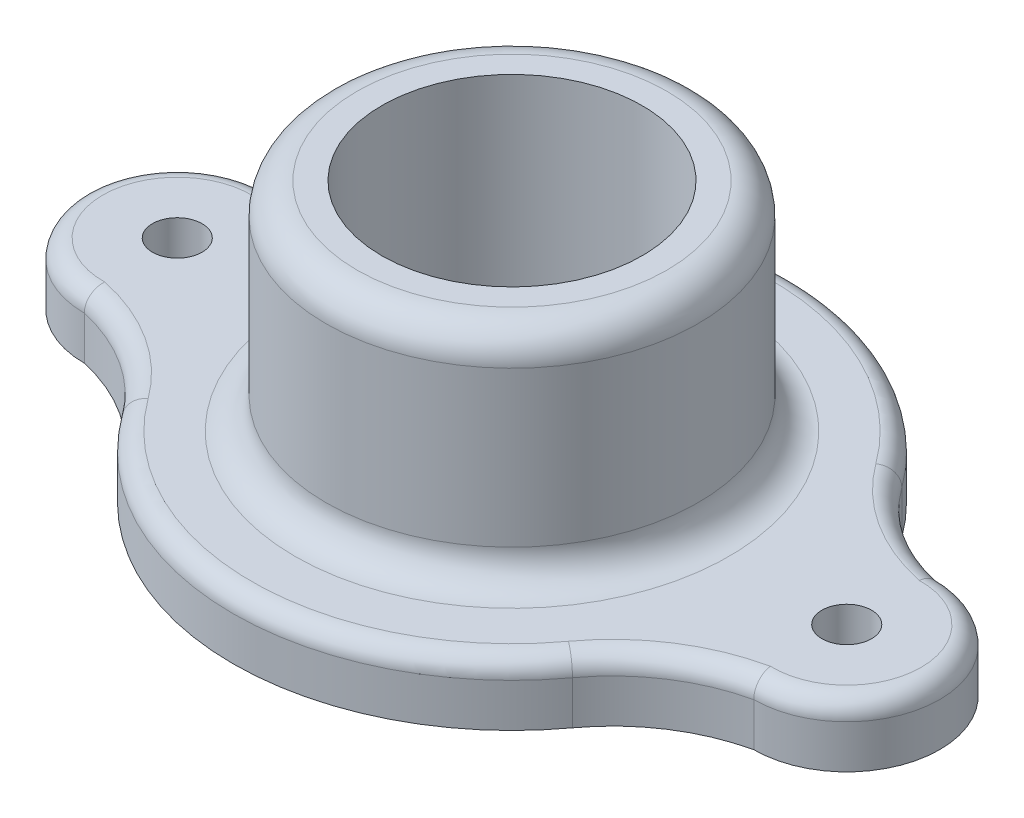
ISO-10303-21;
HEADER;
FILE_DESCRIPTION(('STEP AP214'),'2;1');
FILE_NAME('part.step','',(''),(''),'','','');
FILE_SCHEMA(('AUTOMOTIVE_DESIGN { 1 0 10303 214 1 1 1 1 }'));
ENDSEC;
DATA;
#1=APPLICATION_CONTEXT('core data for automotive mechanical design processes');
#2=APPLICATION_PROTOCOL_DEFINITION('international standard','automotive_design',2000,#1);
#3=PRODUCT_CONTEXT('',#1,'mechanical');
#4=PRODUCT('Part','Part','',(#3));
#5=PRODUCT_RELATED_PRODUCT_CATEGORY('part','',(#4));
#6=PRODUCT_DEFINITION_FORMATION('','',#4);
#7=PRODUCT_DEFINITION_CONTEXT('part definition',#1,'design');
#8=PRODUCT_DEFINITION('design','',#6,#7);
#9=PRODUCT_DEFINITION_SHAPE('','',#8);
#10=(LENGTH_UNIT() NAMED_UNIT(*) SI_UNIT(.MILLI.,.METRE.));
#11=(NAMED_UNIT(*) PLANE_ANGLE_UNIT() SI_UNIT($,.RADIAN.));
#12=(NAMED_UNIT(*) SI_UNIT($,.STERADIAN.) SOLID_ANGLE_UNIT());
#13=UNCERTAINTY_MEASURE_WITH_UNIT(LENGTH_MEASURE(1.E-05),#10,'distance_accuracy_value','');
#14=(GEOMETRIC_REPRESENTATION_CONTEXT(3) GLOBAL_UNCERTAINTY_ASSIGNED_CONTEXT((#13)) GLOBAL_UNIT_ASSIGNED_CONTEXT((#10,
#11,#12)) REPRESENTATION_CONTEXT('',''));
#15=CARTESIAN_POINT('',(0.,0.,0.));
#16=DIRECTION('',(0.,0.,1.));
#17=DIRECTION('',(1.,0.,0.));
#18=AXIS2_PLACEMENT_3D('',#15,#16,#17);
#19=CARTESIAN_POINT('',(-30.2666738587196,10.,-22.1399741086095));
#20=DIRECTION('',(0.,1.,0.));
#21=DIRECTION('',(0.,0.,1.));
#22=AXIS2_PLACEMENT_3D('',#19,#20,#21);
#23=PLANE('',#22);
#24=CARTESIAN_POINT('',(60.5333477174391,10.,44.2799482172191));
#25=DIRECTION('',(0.,1.,0.));
#26=DIRECTION('',(0.,0.,1.));
#27=AXIS2_PLACEMENT_3D('',#24,#25,#26);
#28=CIRCLE('',#27,33.);
#29=CARTESIAN_POINT('',(33.8986747217659,10.,24.7967710016427));
#30=VERTEX_POINT('',#29);
#31=CARTESIAN_POINT('',(53.6955450866771,10.,11.9961371785152));
#32=VERTEX_POINT('',#31);
#33=EDGE_CURVE('E250',#30,#32,#28,.F.);
#34=ORIENTED_EDGE('',*,*,#33,.T.);
#35=CARTESIAN_POINT('',(54.,10.,0.));
#36=DIRECTION('',(0.,1.,0.));
#37=DIRECTION('',(0.,0.,1.));
#38=AXIS2_PLACEMENT_3D('',#35,#36,#37);
#39=CIRCLE('',#38,12.);
#40=CARTESIAN_POINT('',(53.6955450866771,10.,-11.9961371785152));
#41=VERTEX_POINT('',#40);
#42=EDGE_CURVE('E266',#32,#41,#39,.T.);
#43=ORIENTED_EDGE('',*,*,#42,.T.);
#44=CARTESIAN_POINT('',(60.5333477174391,10.,-44.2799482172191));
#45=DIRECTION('',(0.,1.,0.));
#46=DIRECTION('',(0.,0.,1.));
#47=AXIS2_PLACEMENT_3D('',#44,#45,#46);
#48=CIRCLE('',#47,33.);
#49=CARTESIAN_POINT('',(33.8986747217659,10.,-24.7967710016427));
#50=VERTEX_POINT('',#49);
#51=EDGE_CURVE('E263',#41,#50,#48,.F.);
#52=ORIENTED_EDGE('',*,*,#51,.T.);
#53=CARTESIAN_POINT('',(0.,10.,0.));
#54=DIRECTION('',(0.,1.,0.));
#55=DIRECTION('',(0.,0.,1.));
#56=AXIS2_PLACEMENT_3D('',#53,#54,#55);
#57=CIRCLE('',#56,42.);
#58=CARTESIAN_POINT('',(-33.8986747217659,10.,-24.7967710016427));
#59=VERTEX_POINT('',#58);
#60=EDGE_CURVE('E260',#50,#59,#57,.T.);
#61=ORIENTED_EDGE('',*,*,#60,.T.);
#62=CARTESIAN_POINT('',(-60.5333477174391,10.,-44.2799482172191));
#63=DIRECTION('',(0.,1.,0.));
#64=DIRECTION('',(0.,0.,1.));
#65=AXIS2_PLACEMENT_3D('',#62,#63,#64);
#66=CIRCLE('',#65,33.);
#67=CARTESIAN_POINT('',(-53.695545086677,10.,-11.9961371785151));
#68=VERTEX_POINT('',#67);
#69=EDGE_CURVE('E257',#59,#68,#66,.F.);
#70=ORIENTED_EDGE('',*,*,#69,.T.);
#71=CARTESIAN_POINT('',(-54.,10.,0.));
#72=DIRECTION('',(0.,1.,0.));
#73=DIRECTION('',(0.,0.,1.));
#74=AXIS2_PLACEMENT_3D('',#71,#72,#73);
#75=CIRCLE('',#74,12.);
#76=CARTESIAN_POINT('',(-53.6955450866771,10.,11.9961371785151));
#77=VERTEX_POINT('',#76);
#78=EDGE_CURVE('E254',#68,#77,#75,.T.);
#79=ORIENTED_EDGE('',*,*,#78,.T.);
#80=CARTESIAN_POINT('',(-60.5333477174391,10.,44.2799482172191));
#81=DIRECTION('',(0.,1.,0.));
#82=DIRECTION('',(0.,0.,1.));
#83=AXIS2_PLACEMENT_3D('',#80,#81,#82);
#84=CIRCLE('',#83,33.);
#85=CARTESIAN_POINT('',(-33.8986747217659,10.,24.7967710016427));
#86=VERTEX_POINT('',#85);
#87=EDGE_CURVE('E247',#77,#86,#84,.F.);
#88=ORIENTED_EDGE('',*,*,#87,.T.);
#89=CARTESIAN_POINT('',(0.,10.,0.));
#90=DIRECTION('',(0.,1.,0.));
#91=DIRECTION('',(0.,0.,1.));
#92=AXIS2_PLACEMENT_3D('',#89,#90,#91);
#93=CIRCLE('',#92,42.);
#94=EDGE_CURVE('E244',#86,#30,#93,.T.);
#95=ORIENTED_EDGE('',*,*,#94,.T.);
#96=EDGE_LOOP('',(#34,#43,#52,#61,#70,#79,#88,#95));
#97=FACE_BOUND('',#96,.T.);
#98=CARTESIAN_POINT('',(0.,10.,0.));
#99=DIRECTION('',(0.,1.,0.));
#100=DIRECTION('',(0.,0.,1.));
#101=AXIS2_PLACEMENT_3D('',#98,#99,#100);
#102=CIRCLE('',#101,35.);
#103=CARTESIAN_POINT('',(0.,10.,35.));
#104=VERTEX_POINT('',#103);
#105=EDGE_CURVE('E240',#104,#104,#102,.F.);
#106=ORIENTED_EDGE('',*,*,#105,.T.);
#107=EDGE_LOOP('',(#106));
#108=FACE_BOUND('',#107,.T.);
#109=CARTESIAN_POINT('',(-54.,10.,0.));
#110=DIRECTION('',(0.,1.,0.));
#111=DIRECTION('',(0.,0.,1.));
#112=AXIS2_PLACEMENT_3D('',#109,#110,#111);
#113=CIRCLE('',#112,4.);
#114=CARTESIAN_POINT('',(-54.,10.,4.));
#115=VERTEX_POINT('',#114);
#116=EDGE_CURVE('E173',#115,#115,#113,.T.);
#117=ORIENTED_EDGE('',*,*,#116,.F.);
#118=EDGE_LOOP('',(#117));
#119=FACE_BOUND('',#118,.T.);
#120=CARTESIAN_POINT('',(54.,10.,0.));
#121=DIRECTION('',(0.,1.,0.));
#122=DIRECTION('',(0.,0.,1.));
#123=AXIS2_PLACEMENT_3D('',#120,#121,#122);
#124=CIRCLE('',#123,4.);
#125=CARTESIAN_POINT('',(54.,10.,4.));
#126=VERTEX_POINT('',#125);
#127=EDGE_CURVE('E435',#126,#126,#124,.T.);
#128=ORIENTED_EDGE('',*,*,#127,.F.);
#129=EDGE_LOOP('',(#128));
#130=FACE_BOUND('',#129,.T.);
#131=ADVANCED_FACE('F47',(#97,#108,#119,#130),#23,.T.);
#132=CARTESIAN_POINT('',(-30.2666738587196,0.,-22.1399741086095));
#133=DIRECTION('',(0.,1.,0.));
#134=DIRECTION('',(0.,0.,1.));
#135=AXIS2_PLACEMENT_3D('',#132,#133,#134);
#136=PLANE('',#135);
#137=CARTESIAN_POINT('',(0.,0.,0.));
#138=DIRECTION('',(0.,1.,0.));
#139=DIRECTION('',(0.,0.,1.));
#140=AXIS2_PLACEMENT_3D('',#137,#138,#139);
#141=CIRCLE('',#140,26.);
#142=CARTESIAN_POINT('',(0.,0.,26.));
#143=VERTEX_POINT('',#142);
#144=EDGE_CURVE('E154',#143,#143,#141,.T.);
#145=ORIENTED_EDGE('',*,*,#144,.T.);
#146=EDGE_LOOP('',(#145));
#147=FACE_BOUND('',#146,.T.);
#148=CARTESIAN_POINT('',(-60.5333477174391,0.,-44.2799482172191));
#149=DIRECTION('',(0.,-1.,0.));
#150=DIRECTION('',(0.,0.,1.));
#151=AXIS2_PLACEMENT_3D('',#148,#149,#150);
#152=CIRCLE('',#151,30.);
#153=CARTESIAN_POINT('',(-36.3200086304635,0.,-26.5679689303315));
#154=VERTEX_POINT('',#153);
#155=CARTESIAN_POINT('',(-54.,0.,-15.));
#156=VERTEX_POINT('',#155);
#157=EDGE_CURVE('E162',#154,#156,#152,.T.);
#158=ORIENTED_EDGE('',*,*,#157,.F.);
#159=CARTESIAN_POINT('',(0.,0.,0.));
#160=DIRECTION('',(0.,1.,0.));
#161=DIRECTION('',(0.,0.,1.));
#162=AXIS2_PLACEMENT_3D('',#159,#160,#161);
#163=CIRCLE('',#162,45.);
#164=CARTESIAN_POINT('',(36.3200086304635,0.,-26.5679689303315));
#165=VERTEX_POINT('',#164);
#166=EDGE_CURVE('E199',#165,#154,#163,.T.);
#167=ORIENTED_EDGE('',*,*,#166,.F.);
#168=CARTESIAN_POINT('',(60.5333477174391,0.,-44.2799482172191));
#169=DIRECTION('',(0.,-1.,0.));
#170=DIRECTION('',(0.,0.,-1.));
#171=AXIS2_PLACEMENT_3D('',#168,#169,#170);
#172=CIRCLE('',#171,30.);
#173=CARTESIAN_POINT('',(54.,0.,-15.));
#174=VERTEX_POINT('',#173);
#175=EDGE_CURVE('E195',#174,#165,#172,.T.);
#176=ORIENTED_EDGE('',*,*,#175,.F.);
#177=CARTESIAN_POINT('',(54.,0.,0.));
#178=DIRECTION('',(0.,1.,0.));
#179=DIRECTION('',(0.,0.,1.));
#180=AXIS2_PLACEMENT_3D('',#177,#178,#179);
#181=CIRCLE('',#180,15.);
#182=CARTESIAN_POINT('',(54.,0.,15.));
#183=VERTEX_POINT('',#182);
#184=EDGE_CURVE('E191',#183,#174,#181,.T.);
#185=ORIENTED_EDGE('',*,*,#184,.F.);
#186=CARTESIAN_POINT('',(60.5333477174391,0.,44.2799482172191));
#187=DIRECTION('',(0.,-1.,0.));
#188=DIRECTION('',(0.,0.,1.));
#189=AXIS2_PLACEMENT_3D('',#186,#187,#188);
#190=CIRCLE('',#189,30.);
#191=CARTESIAN_POINT('',(36.3200086304635,0.,26.5679689303314));
#192=VERTEX_POINT('',#191);
#193=EDGE_CURVE('E187',#192,#183,#190,.T.);
#194=ORIENTED_EDGE('',*,*,#193,.F.);
#195=CARTESIAN_POINT('',(0.,0.,0.));
#196=DIRECTION('',(0.,1.,0.));
#197=DIRECTION('',(0.,0.,1.));
#198=AXIS2_PLACEMENT_3D('',#195,#196,#197);
#199=CIRCLE('',#198,45.);
#200=CARTESIAN_POINT('',(-36.3200086304635,0.,26.5679689303315));
#201=VERTEX_POINT('',#200);
#202=EDGE_CURVE('E183',#201,#192,#199,.T.);
#203=ORIENTED_EDGE('',*,*,#202,.F.);
#204=CARTESIAN_POINT('',(-60.5333477174391,0.,44.2799482172191));
#205=DIRECTION('',(0.,-1.,0.));
#206=DIRECTION('',(0.,0.,-1.));
#207=AXIS2_PLACEMENT_3D('',#204,#205,#206);
#208=CIRCLE('',#207,30.);
#209=CARTESIAN_POINT('',(-54.,0.,15.));
#210=VERTEX_POINT('',#209);
#211=EDGE_CURVE('E165',#210,#201,#208,.T.);
#212=ORIENTED_EDGE('',*,*,#211,.F.);
#213=CARTESIAN_POINT('',(-54.,0.,0.));
#214=DIRECTION('',(0.,1.,0.));
#215=DIRECTION('',(0.,0.,1.));
#216=AXIS2_PLACEMENT_3D('',#213,#214,#215);
#217=CIRCLE('',#216,15.);
#218=EDGE_CURVE('E147',#156,#210,#217,.T.);
#219=ORIENTED_EDGE('',*,*,#218,.F.);
#220=EDGE_LOOP('',(#158,#167,#176,#185,#194,#203,#212,#219));
#221=FACE_BOUND('',#220,.T.);
#222=CARTESIAN_POINT('',(-54.,0.,0.));
#223=DIRECTION('',(0.,1.,0.));
#224=DIRECTION('',(0.,0.,1.));
#225=AXIS2_PLACEMENT_3D('',#222,#223,#224);
#226=CIRCLE('',#225,4.);
#227=CARTESIAN_POINT('',(-54.,0.,4.));
#228=VERTEX_POINT('',#227);
#229=EDGE_CURVE('E177',#228,#228,#226,.T.);
#230=ORIENTED_EDGE('',*,*,#229,.T.);
#231=EDGE_LOOP('',(#230));
#232=FACE_BOUND('',#231,.T.);
#233=CARTESIAN_POINT('',(54.,0.,0.));
#234=DIRECTION('',(0.,1.,0.));
#235=DIRECTION('',(0.,0.,1.));
#236=AXIS2_PLACEMENT_3D('',#233,#234,#235);
#237=CIRCLE('',#236,4.);
#238=CARTESIAN_POINT('',(54.,0.,4.));
#239=VERTEX_POINT('',#238);
#240=EDGE_CURVE('E438',#239,#239,#237,.T.);
#241=ORIENTED_EDGE('',*,*,#240,.T.);
#242=EDGE_LOOP('',(#241));
#243=FACE_BOUND('',#242,.T.);
#244=ADVANCED_FACE('F159',(#147,#221,#232,#243),#136,.F.);
#245=CARTESIAN_POINT('',(-60.5333477174391,10.,-44.2799482172191));
#246=DIRECTION('',(0.,-1.,0.));
#247=DIRECTION('',(0.,0.,-1.));
#248=AXIS2_PLACEMENT_3D('',#245,#246,#247);
#249=CYLINDRICAL_SURFACE('',#248,30.);
#250=DIRECTION('',(0.,-1.,0.));
#251=VECTOR('',#250,1.);
#252=CARTESIAN_POINT('',(-54.,10.,-15.));
#253=LINE('',#252,#251);
#254=CARTESIAN_POINT('',(-54.,7.,-15.));
#255=VERTEX_POINT('',#254);
#256=EDGE_CURVE('E144',#255,#156,#253,.T.);
#257=ORIENTED_EDGE('',*,*,#256,.F.);
#258=CARTESIAN_POINT('',(-60.5333477174391,7.,-44.2799482172191));
#259=DIRECTION('',(0.,1.,0.));
#260=DIRECTION('',(0.,0.,1.));
#261=AXIS2_PLACEMENT_3D('',#258,#259,#260);
#262=CIRCLE('',#261,30.);
#263=CARTESIAN_POINT('',(-36.3200086304635,7.,-26.5679689303315));
#264=VERTEX_POINT('',#263);
#265=EDGE_CURVE('E282',#255,#264,#262,.T.);
#266=ORIENTED_EDGE('',*,*,#265,.T.);
#267=DIRECTION('',(0.,-1.,0.));
#268=VECTOR('',#267,1.);
#269=CARTESIAN_POINT('',(-36.3200086304635,10.,-26.5679689303315));
#270=LINE('',#269,#268);
#271=EDGE_CURVE('E170',#264,#154,#270,.T.);
#272=ORIENTED_EDGE('',*,*,#271,.T.);
#273=ORIENTED_EDGE('',*,*,#157,.T.);
#274=EDGE_LOOP('',(#257,#266,#272,#273));
#275=FACE_BOUND('',#274,.T.);
#276=ADVANCED_FACE('F168',(#275),#249,.F.);
#277=CARTESIAN_POINT('',(-54.,10.,0.));
#278=DIRECTION('',(0.,-1.,0.));
#279=DIRECTION('',(0.,0.,-1.));
#280=AXIS2_PLACEMENT_3D('',#277,#278,#279);
#281=CYLINDRICAL_SURFACE('',#280,15.);
#282=DIRECTION('',(0.,-1.,0.));
#283=VECTOR('',#282,1.);
#284=CARTESIAN_POINT('',(-54.,10.,15.));
#285=LINE('',#284,#283);
#286=CARTESIAN_POINT('',(-54.,7.,15.));
#287=VERTEX_POINT('',#286);
#288=EDGE_CURVE('E155',#287,#210,#285,.T.);
#289=ORIENTED_EDGE('',*,*,#288,.F.);
#290=CARTESIAN_POINT('',(-54.,7.,0.));
#291=DIRECTION('',(0.,1.,0.));
#292=DIRECTION('',(0.,0.,1.));
#293=AXIS2_PLACEMENT_3D('',#290,#291,#292);
#294=CIRCLE('',#293,15.);
#295=EDGE_CURVE('E63',#287,#255,#294,.F.);
#296=ORIENTED_EDGE('',*,*,#295,.T.);
#297=ORIENTED_EDGE('',*,*,#256,.T.);
#298=ORIENTED_EDGE('',*,*,#218,.T.);
#299=EDGE_LOOP('',(#289,#296,#297,#298));
#300=FACE_BOUND('',#299,.T.);
#301=ADVANCED_FACE('F146',(#300),#281,.T.);
#302=CARTESIAN_POINT('',(-60.5333477174391,10.,44.2799482172191));
#303=DIRECTION('',(0.,-1.,0.));
#304=DIRECTION('',(0.,0.,-1.));
#305=AXIS2_PLACEMENT_3D('',#302,#303,#304);
#306=CYLINDRICAL_SURFACE('',#305,30.);
#307=DIRECTION('',(0.,-1.,0.));
#308=VECTOR('',#307,1.);
#309=CARTESIAN_POINT('',(-36.3200086304635,10.,26.5679689303315));
#310=LINE('',#309,#308);
#311=CARTESIAN_POINT('',(-36.3200086304635,7.,26.5679689303315));
#312=VERTEX_POINT('',#311);
#313=EDGE_CURVE('E216',#312,#201,#310,.T.);
#314=ORIENTED_EDGE('',*,*,#313,.F.);
#315=CARTESIAN_POINT('',(-60.5333477174391,7.,44.2799482172191));
#316=DIRECTION('',(0.,1.,0.));
#317=DIRECTION('',(0.,0.,1.));
#318=AXIS2_PLACEMENT_3D('',#315,#316,#317);
#319=CIRCLE('',#318,30.);
#320=EDGE_CURVE('E71',#312,#287,#319,.T.);
#321=ORIENTED_EDGE('',*,*,#320,.T.);
#322=ORIENTED_EDGE('',*,*,#288,.T.);
#323=ORIENTED_EDGE('',*,*,#211,.T.);
#324=EDGE_LOOP('',(#314,#321,#322,#323));
#325=FACE_BOUND('',#324,.T.);
#326=ADVANCED_FACE('F388',(#325),#306,.F.);
#327=CARTESIAN_POINT('',(0.,10.,0.));
#328=DIRECTION('',(0.,-1.,0.));
#329=DIRECTION('',(0.,0.,-1.));
#330=AXIS2_PLACEMENT_3D('',#327,#328,#329);
#331=CYLINDRICAL_SURFACE('',#330,45.);
#332=DIRECTION('',(0.,-1.,0.));
#333=VECTOR('',#332,1.);
#334=CARTESIAN_POINT('',(36.3200086304635,10.,26.5679689303314));
#335=LINE('',#334,#333);
#336=CARTESIAN_POINT('',(36.3200086304635,7.,26.5679689303314));
#337=VERTEX_POINT('',#336);
#338=EDGE_CURVE('E213',#337,#192,#335,.T.);
#339=ORIENTED_EDGE('',*,*,#338,.F.);
#340=CARTESIAN_POINT('',(0.,7.,0.));
#341=DIRECTION('',(0.,1.,0.));
#342=DIRECTION('',(0.,0.,1.));
#343=AXIS2_PLACEMENT_3D('',#340,#341,#342);
#344=CIRCLE('',#343,45.);
#345=EDGE_CURVE('E12',#337,#312,#344,.F.);
#346=ORIENTED_EDGE('',*,*,#345,.T.);
#347=ORIENTED_EDGE('',*,*,#313,.T.);
#348=ORIENTED_EDGE('',*,*,#202,.T.);
#349=EDGE_LOOP('',(#339,#346,#347,#348));
#350=FACE_BOUND('',#349,.T.);
#351=ADVANCED_FACE('F384',(#350),#331,.T.);
#352=CARTESIAN_POINT('',(60.5333477174391,10.,44.2799482172191));
#353=DIRECTION('',(0.,-1.,0.));
#354=DIRECTION('',(0.,0.,-1.));
#355=AXIS2_PLACEMENT_3D('',#352,#353,#354);
#356=CYLINDRICAL_SURFACE('',#355,30.);
#357=DIRECTION('',(0.,-1.,0.));
#358=VECTOR('',#357,1.);
#359=CARTESIAN_POINT('',(54.,10.,15.));
#360=LINE('',#359,#358);
#361=CARTESIAN_POINT('',(54.,7.,15.));
#362=VERTEX_POINT('',#361);
#363=EDGE_CURVE('E210',#362,#183,#360,.T.);
#364=ORIENTED_EDGE('',*,*,#363,.F.);
#365=CARTESIAN_POINT('',(60.5333477174391,7.,44.2799482172191));
#366=DIRECTION('',(0.,1.,0.));
#367=DIRECTION('',(0.,0.,1.));
#368=AXIS2_PLACEMENT_3D('',#365,#366,#367);
#369=CIRCLE('',#368,30.);
#370=EDGE_CURVE('E269',#362,#337,#369,.T.);
#371=ORIENTED_EDGE('',*,*,#370,.T.);
#372=ORIENTED_EDGE('',*,*,#338,.T.);
#373=ORIENTED_EDGE('',*,*,#193,.T.);
#374=EDGE_LOOP('',(#364,#371,#372,#373));
#375=FACE_BOUND('',#374,.T.);
#376=ADVANCED_FACE('F380',(#375),#356,.F.);
#377=CARTESIAN_POINT('',(54.,10.,0.));
#378=DIRECTION('',(0.,-1.,0.));
#379=DIRECTION('',(0.,0.,-1.));
#380=AXIS2_PLACEMENT_3D('',#377,#378,#379);
#381=CYLINDRICAL_SURFACE('',#380,15.);
#382=DIRECTION('',(0.,-1.,0.));
#383=VECTOR('',#382,1.);
#384=CARTESIAN_POINT('',(54.,10.,-15.));
#385=LINE('',#384,#383);
#386=CARTESIAN_POINT('',(54.,7.,-15.));
#387=VERTEX_POINT('',#386);
#388=EDGE_CURVE('E207',#387,#174,#385,.T.);
#389=ORIENTED_EDGE('',*,*,#388,.F.);
#390=CARTESIAN_POINT('',(54.,7.,0.));
#391=DIRECTION('',(0.,1.,0.));
#392=DIRECTION('',(0.,0.,1.));
#393=AXIS2_PLACEMENT_3D('',#390,#391,#392);
#394=CIRCLE('',#393,15.);
#395=EDGE_CURVE('E273',#387,#362,#394,.F.);
#396=ORIENTED_EDGE('',*,*,#395,.T.);
#397=ORIENTED_EDGE('',*,*,#363,.T.);
#398=ORIENTED_EDGE('',*,*,#184,.T.);
#399=EDGE_LOOP('',(#389,#396,#397,#398));
#400=FACE_BOUND('',#399,.T.);
#401=ADVANCED_FACE('F376',(#400),#381,.T.);
#402=CARTESIAN_POINT('',(60.5333477174391,10.,-44.2799482172191));
#403=DIRECTION('',(0.,-1.,0.));
#404=DIRECTION('',(0.,0.,-1.));
#405=AXIS2_PLACEMENT_3D('',#402,#403,#404);
#406=CYLINDRICAL_SURFACE('',#405,30.);
#407=DIRECTION('',(0.,-1.,0.));
#408=VECTOR('',#407,1.);
#409=CARTESIAN_POINT('',(36.3200086304635,10.,-26.5679689303315));
#410=LINE('',#409,#408);
#411=CARTESIAN_POINT('',(36.3200086304635,7.,-26.5679689303315));
#412=VERTEX_POINT('',#411);
#413=EDGE_CURVE('E204',#412,#165,#410,.T.);
#414=ORIENTED_EDGE('',*,*,#413,.F.);
#415=CARTESIAN_POINT('',(60.5333477174391,7.,-44.2799482172191));
#416=DIRECTION('',(0.,1.,0.));
#417=DIRECTION('',(0.,0.,1.));
#418=AXIS2_PLACEMENT_3D('',#415,#416,#417);
#419=CIRCLE('',#418,30.);
#420=EDGE_CURVE('E276',#412,#387,#419,.T.);
#421=ORIENTED_EDGE('',*,*,#420,.T.);
#422=ORIENTED_EDGE('',*,*,#388,.T.);
#423=ORIENTED_EDGE('',*,*,#175,.T.);
#424=EDGE_LOOP('',(#414,#421,#422,#423));
#425=FACE_BOUND('',#424,.T.);
#426=ADVANCED_FACE('F372',(#425),#406,.F.);
#427=CARTESIAN_POINT('',(0.,10.,0.));
#428=DIRECTION('',(0.,-1.,0.));
#429=DIRECTION('',(0.,0.,-1.));
#430=AXIS2_PLACEMENT_3D('',#427,#428,#429);
#431=CYLINDRICAL_SURFACE('',#430,45.);
#432=ORIENTED_EDGE('',*,*,#271,.F.);
#433=CARTESIAN_POINT('',(0.,7.,0.));
#434=DIRECTION('',(0.,1.,0.));
#435=DIRECTION('',(0.,0.,1.));
#436=AXIS2_PLACEMENT_3D('',#433,#434,#435);
#437=CIRCLE('',#436,45.);
#438=EDGE_CURVE('E279',#264,#412,#437,.F.);
#439=ORIENTED_EDGE('',*,*,#438,.T.);
#440=ORIENTED_EDGE('',*,*,#413,.T.);
#441=ORIENTED_EDGE('',*,*,#166,.T.);
#442=EDGE_LOOP('',(#432,#439,#440,#441));
#443=FACE_BOUND('',#442,.T.);
#444=ADVANCED_FACE('F369',(#443),#431,.T.);
#445=CARTESIAN_POINT('',(-54.,10.,0.));
#446=DIRECTION('',(0.,-1.,0.));
#447=DIRECTION('',(0.,0.,-1.));
#448=AXIS2_PLACEMENT_3D('',#445,#446,#447);
#449=CYLINDRICAL_SURFACE('',#448,4.);
#450=ORIENTED_EDGE('',*,*,#116,.T.);
#451=EDGE_LOOP('',(#450));
#452=FACE_BOUND('',#451,.T.);
#453=ORIENTED_EDGE('',*,*,#229,.F.);
#454=EDGE_LOOP('',(#453));
#455=FACE_BOUND('',#454,.T.);
#456=ADVANCED_FACE('F366',(#452,#455),#449,.F.);
#457=CARTESIAN_POINT('',(54.,10.,0.));
#458=DIRECTION('',(0.,-1.,0.));
#459=DIRECTION('',(0.,0.,-1.));
#460=AXIS2_PLACEMENT_3D('',#457,#458,#459);
#461=CYLINDRICAL_SURFACE('',#460,4.);
#462=ORIENTED_EDGE('',*,*,#127,.T.);
#463=EDGE_LOOP('',(#462));
#464=FACE_BOUND('',#463,.T.);
#465=ORIENTED_EDGE('',*,*,#240,.F.);
#466=EDGE_LOOP('',(#465));
#467=FACE_BOUND('',#466,.T.);
#468=ADVANCED_FACE('F423',(#464,#467),#461,.F.);
#469=CARTESIAN_POINT('',(0.,45.,0.));
#470=DIRECTION('',(0.,1.,0.));
#471=DIRECTION('',(0.,0.,1.));
#472=AXIS2_PLACEMENT_3D('',#469,#470,#471);
#473=PLANE('',#472);
#474=CARTESIAN_POINT('',(0.,45.,0.));
#475=DIRECTION('',(0.,1.,0.));
#476=DIRECTION('',(0.,0.,1.));
#477=AXIS2_PLACEMENT_3D('',#474,#475,#476);
#478=CIRCLE('',#477,25.);
#479=CARTESIAN_POINT('',(0.,45.,25.));
#480=VERTEX_POINT('',#479);
#481=EDGE_CURVE('E228',#480,#480,#478,.T.);
#482=ORIENTED_EDGE('',*,*,#481,.T.);
#483=EDGE_LOOP('',(#482));
#484=FACE_BOUND('',#483,.T.);
#485=CARTESIAN_POINT('',(0.,45.,0.));
#486=DIRECTION('',(0.,1.,0.));
#487=DIRECTION('',(0.,0.,1.));
#488=AXIS2_PLACEMENT_3D('',#485,#486,#487);
#489=CIRCLE('',#488,21.);
#490=CARTESIAN_POINT('',(0.,45.,21.));
#491=VERTEX_POINT('',#490);
#492=EDGE_CURVE('E441',#491,#491,#489,.T.);
#493=ORIENTED_EDGE('',*,*,#492,.F.);
#494=EDGE_LOOP('',(#493));
#495=FACE_BOUND('',#494,.T.);
#496=ADVANCED_FACE('F414',(#484,#495),#473,.T.);
#497=CARTESIAN_POINT('',(0.,45.,0.));
#498=DIRECTION('',(0.,-1.,0.));
#499=DIRECTION('',(0.,0.,-1.));
#500=AXIS2_PLACEMENT_3D('',#497,#498,#499);
#501=CYLINDRICAL_SURFACE('',#500,30.);
#502=CARTESIAN_POINT('',(0.,40.,0.));
#503=DIRECTION('',(0.,1.,0.));
#504=DIRECTION('',(0.,0.,1.));
#505=AXIS2_PLACEMENT_3D('',#502,#503,#504);
#506=CIRCLE('',#505,30.);
#507=CARTESIAN_POINT('',(0.,40.,30.));
#508=VERTEX_POINT('',#507);
#509=EDGE_CURVE('E236',#508,#508,#506,.F.);
#510=ORIENTED_EDGE('',*,*,#509,.T.);
#511=EDGE_LOOP('',(#510));
#512=FACE_BOUND('',#511,.T.);
#513=CARTESIAN_POINT('',(0.,15.,0.));
#514=DIRECTION('',(0.,1.,0.));
#515=DIRECTION('',(0.,0.,1.));
#516=AXIS2_PLACEMENT_3D('',#513,#514,#515);
#517=CIRCLE('',#516,30.);
#518=CARTESIAN_POINT('',(0.,15.,30.));
#519=VERTEX_POINT('',#518);
#520=EDGE_CURVE('E232',#519,#519,#517,.T.);
#521=ORIENTED_EDGE('',*,*,#520,.T.);
#522=EDGE_LOOP('',(#521));
#523=FACE_BOUND('',#522,.T.);
#524=ADVANCED_FACE('F412',(#512,#523),#501,.T.);
#525=CARTESIAN_POINT('',(0.,45.,0.));
#526=DIRECTION('',(0.,-1.,0.));
#527=DIRECTION('',(0.,0.,-1.));
#528=AXIS2_PLACEMENT_3D('',#525,#526,#527);
#529=CYLINDRICAL_SURFACE('',#528,21.);
#530=CARTESIAN_POINT('',(0.,5.,0.));
#531=DIRECTION('',(0.,1.,0.));
#532=DIRECTION('',(0.,0.,1.));
#533=AXIS2_PLACEMENT_3D('',#530,#531,#532);
#534=CIRCLE('',#533,21.);
#535=CARTESIAN_POINT('',(0.,5.,21.));
#536=VERTEX_POINT('',#535);
#537=EDGE_CURVE('E224',#536,#536,#534,.F.);
#538=ORIENTED_EDGE('',*,*,#537,.T.);
#539=EDGE_LOOP('',(#538));
#540=FACE_BOUND('',#539,.T.);
#541=ORIENTED_EDGE('',*,*,#492,.T.);
#542=EDGE_LOOP('',(#541));
#543=FACE_BOUND('',#542,.T.);
#544=ADVANCED_FACE('F398',(#540,#543),#529,.F.);
#545=CARTESIAN_POINT('',(0.,5.,0.));
#546=DIRECTION('',(0.,1.,0.));
#547=DIRECTION('',(0.,0.,1.));
#548=AXIS2_PLACEMENT_3D('',#545,#546,#547);
#549=TOROIDAL_SURFACE('',#548,26.,5.);
#550=ORIENTED_EDGE('',*,*,#537,.F.);
#551=EDGE_LOOP('',(#550));
#552=FACE_BOUND('',#551,.T.);
#553=ORIENTED_EDGE('',*,*,#144,.F.);
#554=EDGE_LOOP('',(#553));
#555=FACE_BOUND('',#554,.T.);
#556=ADVANCED_FACE('F394',(#552,#555),#549,.T.);
#557=CARTESIAN_POINT('',(0.,40.,0.));
#558=DIRECTION('',(0.,1.,0.));
#559=DIRECTION('',(0.,0.,1.));
#560=AXIS2_PLACEMENT_3D('',#557,#558,#559);
#561=TOROIDAL_SURFACE('',#560,25.,5.);
#562=ORIENTED_EDGE('',*,*,#509,.F.);
#563=EDGE_LOOP('',(#562));
#564=FACE_BOUND('',#563,.T.);
#565=ORIENTED_EDGE('',*,*,#481,.F.);
#566=EDGE_LOOP('',(#565));
#567=FACE_BOUND('',#566,.T.);
#568=ADVANCED_FACE('F397',(#564,#567),#561,.T.);
#569=CARTESIAN_POINT('',(0.,15.,0.));
#570=DIRECTION('',(0.,1.,0.));
#571=DIRECTION('',(0.,0.,1.));
#572=AXIS2_PLACEMENT_3D('',#569,#570,#571);
#573=TOROIDAL_SURFACE('',#572,35.,5.);
#574=ORIENTED_EDGE('',*,*,#105,.F.);
#575=EDGE_LOOP('',(#574));
#576=FACE_BOUND('',#575,.T.);
#577=ORIENTED_EDGE('',*,*,#520,.F.);
#578=EDGE_LOOP('',(#577));
#579=FACE_BOUND('',#578,.T.);
#580=ADVANCED_FACE('F401',(#576,#579),#573,.F.);
#581=CARTESIAN_POINT('',(-60.5333477174391,7.,-44.2799482172191));
#582=DIRECTION('',(0.,1.,0.));
#583=DIRECTION('',(0.,0.,1.));
#584=AXIS2_PLACEMENT_3D('',#581,#582,#583);
#585=TOROIDAL_SURFACE('',#584,33.,3.);
#586=CARTESIAN_POINT('',(-33.8986747217659,7.,-24.7967710016427));
#587=DIRECTION('',(0.590399309562921,0.,-0.807111302899189));
#588=DIRECTION('',(-0.807111302899189,0.,-0.590399309562921));
#589=AXIS2_PLACEMENT_3D('',#586,#587,#588);
#590=CIRCLE('',#589,3.);
#591=EDGE_CURVE('E339',#264,#59,#590,.T.);
#592=ORIENTED_EDGE('',*,*,#591,.F.);
#593=ORIENTED_EDGE('',*,*,#265,.F.);
#594=CARTESIAN_POINT('',(-54.,7.,-15.));
#595=CARTESIAN_POINT('',(-54.0000013525382,7.08400244602546,-15.0000082891006));
#596=CARTESIAN_POINT('',(-53.9996111680722,7.16800090857542,-14.9964718378319));
#597=CARTESIAN_POINT('',(-53.9980579701973,7.33539416779695,-14.9823735620047));
#598=CARTESIAN_POINT('',(-53.9968950026297,7.41878899997916,-14.9718121541656));
#599=CARTESIAN_POINT('',(-53.993807801811,7.58431860456841,-14.9437400654768));
#600=CARTESIAN_POINT('',(-53.9918842203483,7.6664543934449,-14.9262353344878));
#601=CARTESIAN_POINT('',(-53.9872980813859,7.82892990320093,-14.8844222300115));
#602=CARTESIAN_POINT('',(-53.9846355312781,7.90926964203739,-14.8601139245793));
#603=CARTESIAN_POINT('',(-53.9755739603861,8.14681088388748,-14.7771904375914));
#604=CARTESIAN_POINT('',(-53.9680995434512,8.3006123175205,-14.7085633941743));
#605=CARTESIAN_POINT('',(-53.9506010152617,8.59436646191993,-14.5467111493213));
#606=CARTESIAN_POINT('',(-53.9405773735237,8.73432171629105,-14.4534904774246));
#607=CARTESIAN_POINT('',(-53.9183507689473,8.99696445458088,-14.2448332007605));
#608=CARTESIAN_POINT('',(-53.9061423770837,9.11960752827409,-14.1293411957581));
#609=CARTESIAN_POINT('',(-53.8800361845824,9.34382083114347,-13.8795567690778));
#610=CARTESIAN_POINT('',(-53.866137848895,9.44538435867121,-13.7452583910989));
#611=CARTESIAN_POINT('',(-53.8370923692938,9.62515703172606,-13.4608654170148));
#612=CARTESIAN_POINT('',(-53.8219383390306,9.70322480158635,-13.3106822695643));
#613=CARTESIAN_POINT('',(-53.7910042349885,9.83302859178891,-12.999455560889));
#614=CARTESIAN_POINT('',(-53.7752245973038,9.88478261857172,-12.8384195119747));
#615=CARTESIAN_POINT('',(-53.749048434842,9.94755030869829,-12.5668124482128));
#616=CARTESIAN_POINT('',(-53.7386719080686,9.96645845898132,-12.4579873007638));
#617=CARTESIAN_POINT('',(-53.7180314709036,9.99221673690607,-12.2390240747654));
#618=CARTESIAN_POINT('',(-53.7077674003332,9.99908711034008,-12.1288885149227));
#619=CARTESIAN_POINT('',(-53.6969337292814,9.999971719452,-12.0112364291013));
#620=CARTESIAN_POINT('',(-53.6962391000333,10.0000000735188,-12.0036865994435));
#621=CARTESIAN_POINT('',(-53.6955450866771,10.,-11.9961371785151));
#622=B_SPLINE_CURVE_WITH_KNOTS('',3,(#594,#595,#596,#597,#598,#599,#600,#601,#602,#603,#604,
#605,#606,#607,#608,#609,#610,#611,#612,#613,#614,#615,#616,#617,#618,#619,#620,#621),
.UNSPECIFIED.,.F.,.F.,(4,2,2,2,2,2,2,2,2,2,2,2,2,4),(0.,0.25192487429598,0.503834805781076,
0.755529335779231,1.0072213482083,1.51037122642248,2.01342850146317,2.51775366758488,
3.02223892492666,3.52970166002193,4.03681667045674,4.36906911839989,4.70076222765325,
4.72350728600376),.UNSPECIFIED.);
#623=EDGE_CURVE('E52',#68,#255,#622,.F.);
#624=ORIENTED_EDGE('',*,*,#623,.F.);
#625=ORIENTED_EDGE('',*,*,#69,.F.);
#626=EDGE_LOOP('',(#592,#593,#624,#625));
#627=FACE_BOUND('',#626,.T.);
#628=ADVANCED_FACE('F49',(#627),#585,.T.);
#629=CARTESIAN_POINT('',(-54.,7.,0.));
#630=DIRECTION('',(0.,1.,0.));
#631=DIRECTION('',(0.,0.,1.));
#632=AXIS2_PLACEMENT_3D('',#629,#630,#631);
#633=TOROIDAL_SURFACE('',#632,12.,3.);
#634=ORIENTED_EDGE('',*,*,#623,.T.);
#635=ORIENTED_EDGE('',*,*,#295,.F.);
#636=CARTESIAN_POINT('',(-54.,7.,15.));
#637=CARTESIAN_POINT('',(-54.0000013525382,7.08400244602546,15.0000082891006));
#638=CARTESIAN_POINT('',(-53.9996111680722,7.16800090857542,14.9964718378319));
#639=CARTESIAN_POINT('',(-53.9980579701974,7.33539416779695,14.9823735620047));
#640=CARTESIAN_POINT('',(-53.9968950026298,7.41878899997916,14.9718121541656));
#641=CARTESIAN_POINT('',(-53.9938078018111,7.58431860456841,14.9437400654768));
#642=CARTESIAN_POINT('',(-53.9918842203483,7.6664543934449,14.9262353344878));
#643=CARTESIAN_POINT('',(-53.9872980813859,7.82892990320093,14.8844222300115));
#644=CARTESIAN_POINT('',(-53.9846355312781,7.90926964203739,14.8601139245793));
#645=CARTESIAN_POINT('',(-53.9755739603861,8.14681088388748,14.7771904375914));
#646=CARTESIAN_POINT('',(-53.9680995434512,8.3006123175205,14.7085633941743));
#647=CARTESIAN_POINT('',(-53.9506010152618,8.59436646191993,14.5467111493213));
#648=CARTESIAN_POINT('',(-53.9405773735237,8.73432171629105,14.4534904774246));
#649=CARTESIAN_POINT('',(-53.9183507689473,8.99696445458088,14.2448332007605));
#650=CARTESIAN_POINT('',(-53.9061423770837,9.11960752827409,14.1293411957581));
#651=CARTESIAN_POINT('',(-53.8800361845825,9.34382083114347,13.8795567690778));
#652=CARTESIAN_POINT('',(-53.8661378488951,9.44538435867121,13.7452583910989));
#653=CARTESIAN_POINT('',(-53.8370923692938,9.62515703172606,13.4608654170148));
#654=CARTESIAN_POINT('',(-53.8219383390306,9.70322480158635,13.3106822695643));
#655=CARTESIAN_POINT('',(-53.7910042349886,9.83302859178891,12.999455560889));
#656=CARTESIAN_POINT('',(-53.7752245973039,9.88478261857172,12.8384195119747));
#657=CARTESIAN_POINT('',(-53.749048434842,9.94755030869829,12.5668124482128));
#658=CARTESIAN_POINT('',(-53.7386719080686,9.96645845898132,12.4579873007639));
#659=CARTESIAN_POINT('',(-53.7180314709038,9.99221673690607,12.2390240747654));
#660=CARTESIAN_POINT('',(-53.7077674003336,9.99908711034008,12.1288885149226));
#661=CARTESIAN_POINT('',(-53.6969337292815,9.999971719452,12.0112364291013));
#662=CARTESIAN_POINT('',(-53.6962391000334,10.0000000735188,12.0036865994435));
#663=CARTESIAN_POINT('',(-53.6955450866771,10.,11.9961371785152));
#664=B_SPLINE_CURVE_WITH_KNOTS('',3,(#636,#637,#638,#639,#640,#641,#642,#643,#644,#645,#646,
#647,#648,#649,#650,#651,#652,#653,#654,#655,#656,#657,#658,#659,#660,#661,#662,#663),
.UNSPECIFIED.,.F.,.F.,(4,2,2,2,2,2,2,2,2,2,2,2,2,4),(0.,0.251924874295979,0.503834805781077,
0.755529335779232,1.0072213482083,1.51037122642248,2.01342850146317,2.51775366758489,
3.02223892492666,3.52970166002193,4.03681667045673,4.36906911839989,4.70076222765325,
4.72350728600376),.UNSPECIFIED.);
#665=EDGE_CURVE('E332',#77,#287,#664,.F.);
#666=ORIENTED_EDGE('',*,*,#665,.F.);
#667=ORIENTED_EDGE('',*,*,#78,.F.);
#668=EDGE_LOOP('',(#634,#635,#666,#667));
#669=FACE_BOUND('',#668,.T.);
#670=ADVANCED_FACE('F341',(#669),#633,.T.);
#671=CARTESIAN_POINT('',(0.,7.,0.));
#672=DIRECTION('',(0.,1.,0.));
#673=DIRECTION('',(0.,0.,1.));
#674=AXIS2_PLACEMENT_3D('',#671,#672,#673);
#675=TOROIDAL_SURFACE('',#674,42.,3.);
#676=ORIENTED_EDGE('',*,*,#591,.T.);
#677=ORIENTED_EDGE('',*,*,#60,.F.);
#678=CARTESIAN_POINT('',(33.8986747217659,7.,-24.7967710016427));
#679=DIRECTION('',(0.590399309562921,0.,0.807111302899189));
#680=DIRECTION('',(0.807111302899189,0.,-0.590399309562921));
#681=AXIS2_PLACEMENT_3D('',#678,#679,#680);
#682=CIRCLE('',#681,3.);
#683=EDGE_CURVE('E328',#412,#50,#682,.T.);
#684=ORIENTED_EDGE('',*,*,#683,.F.);
#685=ORIENTED_EDGE('',*,*,#438,.F.);
#686=EDGE_LOOP('',(#676,#677,#684,#685));
#687=FACE_BOUND('',#686,.T.);
#688=ADVANCED_FACE('F344',(#687),#675,.T.);
#689=CARTESIAN_POINT('',(-60.5333477174391,7.,44.2799482172191));
#690=DIRECTION('',(0.,1.,0.));
#691=DIRECTION('',(0.,0.,1.));
#692=AXIS2_PLACEMENT_3D('',#689,#690,#691);
#693=TOROIDAL_SURFACE('',#692,33.,3.);
#694=ORIENTED_EDGE('',*,*,#665,.T.);
#695=ORIENTED_EDGE('',*,*,#320,.F.);
#696=CARTESIAN_POINT('',(-33.8986747217659,7.,24.7967710016427));
#697=DIRECTION('',(0.590399309562921,0.,0.807111302899189));
#698=DIRECTION('',(0.807111302899189,0.,-0.590399309562921));
#699=AXIS2_PLACEMENT_3D('',#696,#697,#698);
#700=CIRCLE('',#699,3.);
#701=EDGE_CURVE('E324',#86,#312,#700,.T.);
#702=ORIENTED_EDGE('',*,*,#701,.F.);
#703=ORIENTED_EDGE('',*,*,#87,.F.);
#704=EDGE_LOOP('',(#694,#695,#702,#703));
#705=FACE_BOUND('',#704,.T.);
#706=ADVANCED_FACE('F313',(#705),#693,.T.);
#707=CARTESIAN_POINT('',(60.5333477174391,7.,-44.2799482172191));
#708=DIRECTION('',(0.,1.,0.));
#709=DIRECTION('',(0.,0.,1.));
#710=AXIS2_PLACEMENT_3D('',#707,#708,#709);
#711=TOROIDAL_SURFACE('',#710,33.,3.);
#712=ORIENTED_EDGE('',*,*,#683,.T.);
#713=ORIENTED_EDGE('',*,*,#51,.F.);
#714=CARTESIAN_POINT('',(54.,7.,-15.));
#715=CARTESIAN_POINT('',(54.0000013525381,7.08400244602546,-15.0000082891006));
#716=CARTESIAN_POINT('',(53.9996111680722,7.16800090857542,-14.9964718378319));
#717=CARTESIAN_POINT('',(53.9980579701973,7.33539416779695,-14.9823735620048));
#718=CARTESIAN_POINT('',(53.9968950026297,7.41878899997916,-14.9718121541656));
#719=CARTESIAN_POINT('',(53.993807801811,7.58431860456841,-14.9437400654768));
#720=CARTESIAN_POINT('',(53.9918842203482,7.6664543934449,-14.9262353344879));
#721=CARTESIAN_POINT('',(53.9872980813859,7.82892990320093,-14.8844222300116));
#722=CARTESIAN_POINT('',(53.984635531278,7.90926964203739,-14.8601139245793));
#723=CARTESIAN_POINT('',(53.9755739603861,8.14681088388748,-14.7771904375914));
#724=CARTESIAN_POINT('',(53.9680995434511,8.3006123175205,-14.7085633941743));
#725=CARTESIAN_POINT('',(53.9506010152617,8.59436646191993,-14.5467111493213));
#726=CARTESIAN_POINT('',(53.9405773735237,8.73432171629105,-14.4534904774246));
#727=CARTESIAN_POINT('',(53.9183507689473,8.99696445458088,-14.2448332007605));
#728=CARTESIAN_POINT('',(53.9061423770836,9.11960752827409,-14.1293411957581));
#729=CARTESIAN_POINT('',(53.8800361845824,9.34382083114347,-13.8795567690778));
#730=CARTESIAN_POINT('',(53.866137848895,9.44538435867121,-13.7452583910989));
#731=CARTESIAN_POINT('',(53.8370923692938,9.62515703172606,-13.4608654170148));
#732=CARTESIAN_POINT('',(53.8219383390305,9.70322480158635,-13.3106822695643));
#733=CARTESIAN_POINT('',(53.7910042349885,9.83302859178891,-12.999455560889));
#734=CARTESIAN_POINT('',(53.7752245973038,9.88478261857172,-12.8384195119747));
#735=CARTESIAN_POINT('',(53.749048434842,9.94755030869829,-12.5668124482128));
#736=CARTESIAN_POINT('',(53.7386719080686,9.96645845898132,-12.4579873007638));
#737=CARTESIAN_POINT('',(53.7180314709036,9.99221673690607,-12.2390240747654));
#738=CARTESIAN_POINT('',(53.7077674003331,9.99908711034008,-12.1288885149227));
#739=CARTESIAN_POINT('',(53.6969337292814,9.999971719452,-12.0112364291013));
#740=CARTESIAN_POINT('',(53.6962391000333,10.0000000735188,-12.0036865994435));
#741=CARTESIAN_POINT('',(53.6955450866771,10.,-11.9961371785152));
#742=B_SPLINE_CURVE_WITH_KNOTS('',3,(#714,#715,#716,#717,#718,#719,#720,#721,#722,#723,#724,
#725,#726,#727,#728,#729,#730,#731,#732,#733,#734,#735,#736,#737,#738,#739,#740,#741),
.UNSPECIFIED.,.F.,.F.,(4,2,2,2,2,2,2,2,2,2,2,2,2,4),(0.,0.25192487429598,0.503834805781078,
0.755529335779233,1.0072213482083,1.51037122642248,2.01342850146317,2.51775366758489,
3.02223892492667,3.52970166002193,4.03681667045674,4.3690691183999,4.70076222765326,
4.72350728600376),.UNSPECIFIED.);
#743=EDGE_CURVE('E316',#387,#41,#742,.T.);
#744=ORIENTED_EDGE('',*,*,#743,.F.);
#745=ORIENTED_EDGE('',*,*,#420,.F.);
#746=EDGE_LOOP('',(#712,#713,#744,#745));
#747=FACE_BOUND('',#746,.T.);
#748=ADVANCED_FACE('F308',(#747),#711,.T.);
#749=CARTESIAN_POINT('',(0.,7.,0.));
#750=DIRECTION('',(0.,1.,0.));
#751=DIRECTION('',(0.,0.,1.));
#752=AXIS2_PLACEMENT_3D('',#749,#750,#751);
#753=TOROIDAL_SURFACE('',#752,42.,3.);
#754=ORIENTED_EDGE('',*,*,#701,.T.);
#755=ORIENTED_EDGE('',*,*,#345,.F.);
#756=CARTESIAN_POINT('',(33.8986747217659,7.,24.7967710016427));
#757=DIRECTION('',(0.590399309562922,0.,-0.807111302899188));
#758=DIRECTION('',(-0.807111302899188,0.,-0.590399309562922));
#759=AXIS2_PLACEMENT_3D('',#756,#757,#758);
#760=CIRCLE('',#759,3.);
#761=EDGE_CURVE('E298',#30,#337,#760,.T.);
#762=ORIENTED_EDGE('',*,*,#761,.F.);
#763=ORIENTED_EDGE('',*,*,#94,.F.);
#764=EDGE_LOOP('',(#754,#755,#762,#763));
#765=FACE_BOUND('',#764,.T.);
#766=ADVANCED_FACE('F312',(#765),#753,.T.);
#767=CARTESIAN_POINT('',(54.,7.,0.));
#768=DIRECTION('',(0.,1.,0.));
#769=DIRECTION('',(0.,0.,1.));
#770=AXIS2_PLACEMENT_3D('',#767,#768,#769);
#771=TOROIDAL_SURFACE('',#770,12.,3.);
#772=ORIENTED_EDGE('',*,*,#743,.T.);
#773=ORIENTED_EDGE('',*,*,#42,.F.);
#774=CARTESIAN_POINT('',(54.,7.,15.));
#775=CARTESIAN_POINT('',(54.0000013525382,7.08400244602546,15.0000082891006));
#776=CARTESIAN_POINT('',(53.9996111680722,7.16800090857542,14.9964718378319));
#777=CARTESIAN_POINT('',(53.9980579701973,7.33539416779695,14.9823735620048));
#778=CARTESIAN_POINT('',(53.9968950026297,7.41878899997916,14.9718121541656));
#779=CARTESIAN_POINT('',(53.993807801811,7.58431860456841,14.9437400654768));
#780=CARTESIAN_POINT('',(53.9918842203483,7.6664543934449,14.9262353344879));
#781=CARTESIAN_POINT('',(53.9872980813859,7.82892990320093,14.8844222300116));
#782=CARTESIAN_POINT('',(53.984635531278,7.90926964203739,14.8601139245793));
#783=CARTESIAN_POINT('',(53.9755739603861,8.14681088388748,14.7771904375914));
#784=CARTESIAN_POINT('',(53.9680995434512,8.3006123175205,14.7085633941743));
#785=CARTESIAN_POINT('',(53.9506010152617,8.59436646191993,14.5467111493213));
#786=CARTESIAN_POINT('',(53.9405773735237,8.73432171629105,14.4534904774246));
#787=CARTESIAN_POINT('',(53.9183507689473,8.99696445458088,14.2448332007605));
#788=CARTESIAN_POINT('',(53.9061423770837,9.11960752827409,14.1293411957581));
#789=CARTESIAN_POINT('',(53.8800361845824,9.34382083114347,13.8795567690778));
#790=CARTESIAN_POINT('',(53.866137848895,9.44538435867121,13.7452583910989));
#791=CARTESIAN_POINT('',(53.8370923692938,9.62515703172606,13.4608654170148));
#792=CARTESIAN_POINT('',(53.8219383390305,9.70322480158635,13.3106822695643));
#793=CARTESIAN_POINT('',(53.7910042349885,9.83302859178891,12.999455560889));
#794=CARTESIAN_POINT('',(53.7752245973038,9.88478261857172,12.8384195119747));
#795=CARTESIAN_POINT('',(53.7490484348419,9.94755030869829,12.5668124482128));
#796=CARTESIAN_POINT('',(53.7386719080685,9.96645845898132,12.4579873007639));
#797=CARTESIAN_POINT('',(53.7180314709037,9.99221673690607,12.2390240747654));
#798=CARTESIAN_POINT('',(53.7077674003335,9.99908711034008,12.1288885149227));
#799=CARTESIAN_POINT('',(53.6969337292815,9.999971719452,12.0112364291013));
#800=CARTESIAN_POINT('',(53.6962391000333,10.0000000735188,12.0036865994435));
#801=CARTESIAN_POINT('',(53.695545086677,10.,11.9961371785152));
#802=B_SPLINE_CURVE_WITH_KNOTS('',3,(#774,#775,#776,#777,#778,#779,#780,#781,#782,#783,#784,
#785,#786,#787,#788,#789,#790,#791,#792,#793,#794,#795,#796,#797,#798,#799,#800,#801),
.UNSPECIFIED.,.F.,.F.,(4,2,2,2,2,2,2,2,2,2,2,2,2,4),(0.,0.25192487429598,0.503834805781076,
0.755529335779232,1.0072213482083,1.51037122642248,2.01342850146317,2.51775366758489,
3.02223892492667,3.52970166002193,4.03681667045673,4.36906911839989,4.70076222765326,
4.72350728600376),.UNSPECIFIED.);
#803=EDGE_CURVE('E289',#362,#32,#802,.T.);
#804=ORIENTED_EDGE('',*,*,#803,.F.);
#805=ORIENTED_EDGE('',*,*,#395,.F.);
#806=EDGE_LOOP('',(#772,#773,#804,#805));
#807=FACE_BOUND('',#806,.T.);
#808=ADVANCED_FACE('F300',(#807),#771,.T.);
#809=CARTESIAN_POINT('',(60.5333477174391,7.,44.2799482172191));
#810=DIRECTION('',(0.,1.,0.));
#811=DIRECTION('',(0.,0.,1.));
#812=AXIS2_PLACEMENT_3D('',#809,#810,#811);
#813=TOROIDAL_SURFACE('',#812,33.,3.);
#814=ORIENTED_EDGE('',*,*,#761,.T.);
#815=ORIENTED_EDGE('',*,*,#370,.F.);
#816=ORIENTED_EDGE('',*,*,#803,.T.);
#817=ORIENTED_EDGE('',*,*,#33,.F.);
#818=EDGE_LOOP('',(#814,#815,#816,#817));
#819=FACE_BOUND('',#818,.T.);
#820=ADVANCED_FACE('F303',(#819),#813,.T.);
#821=CLOSED_SHELL('',(#131,#244,#276,#301,#326,#351,#376,#401,#426,#444,#456,#468,#496,#524,
#544,#556,#568,#580,#628,#670,#688,#706,#748,#766,#808,#820));
#822=MANIFOLD_SOLID_BREP('B2',#821);
#823=ADVANCED_BREP_SHAPE_REPRESENTATION('',(#18,#822),#14);
#824=SHAPE_DEFINITION_REPRESENTATION(#9,#823);
ENDSEC;
END-ISO-10303-21;
